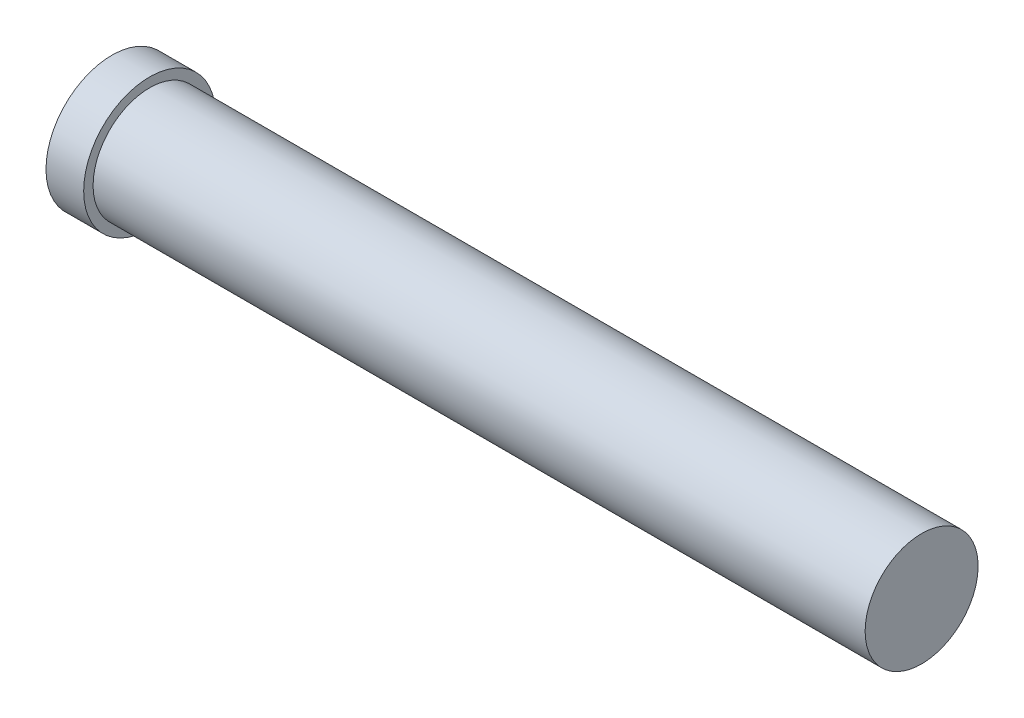
ISO-10303-21;
HEADER;
FILE_DESCRIPTION(('STEP AP214'),'2;1');
FILE_NAME('part.step','',(''),(''),'','','');
FILE_SCHEMA(('AUTOMOTIVE_DESIGN { 1 0 10303 214 1 1 1 1 }'));
ENDSEC;
DATA;
#1=APPLICATION_CONTEXT('core data for automotive mechanical design processes');
#2=APPLICATION_PROTOCOL_DEFINITION('international standard','automotive_design',2000,#1);
#3=PRODUCT_CONTEXT('',#1,'mechanical');
#4=PRODUCT('Part','Part','',(#3));
#5=PRODUCT_RELATED_PRODUCT_CATEGORY('part','',(#4));
#6=PRODUCT_DEFINITION_FORMATION('','',#4);
#7=PRODUCT_DEFINITION_CONTEXT('part definition',#1,'design');
#8=PRODUCT_DEFINITION('design','',#6,#7);
#9=PRODUCT_DEFINITION_SHAPE('','',#8);
#10=(LENGTH_UNIT() NAMED_UNIT(*) SI_UNIT(.MILLI.,.METRE.));
#11=(NAMED_UNIT(*) PLANE_ANGLE_UNIT() SI_UNIT($,.RADIAN.));
#12=(NAMED_UNIT(*) SI_UNIT($,.STERADIAN.) SOLID_ANGLE_UNIT());
#13=UNCERTAINTY_MEASURE_WITH_UNIT(LENGTH_MEASURE(1.E-05),#10,'distance_accuracy_value','');
#14=(GEOMETRIC_REPRESENTATION_CONTEXT(3) GLOBAL_UNCERTAINTY_ASSIGNED_CONTEXT((#13)) GLOBAL_UNIT_ASSIGNED_CONTEXT((#10,
#11,#12)) REPRESENTATION_CONTEXT('',''));
#15=CARTESIAN_POINT('',(0.,0.,0.));
#16=DIRECTION('',(0.,0.,1.));
#17=DIRECTION('',(1.,0.,0.));
#18=AXIS2_PLACEMENT_3D('',#15,#16,#17);
#19=CARTESIAN_POINT('',(0.,0.,0.));
#20=DIRECTION('',(1.,0.,0.));
#21=DIRECTION('',(0.,0.,-1.));
#22=AXIS2_PLACEMENT_3D('',#19,#20,#21);
#23=PLANE('',#22);
#24=CARTESIAN_POINT('',(0.,0.,0.));
#25=DIRECTION('',(-1.,0.,0.));
#26=DIRECTION('',(0.,0.,1.));
#27=AXIS2_PLACEMENT_3D('',#24,#25,#26);
#28=CIRCLE('',#27,35.);
#29=CARTESIAN_POINT('',(0.,0.,35.));
#30=VERTEX_POINT('',#29);
#31=EDGE_CURVE('E10',#30,#30,#28,.T.);
#32=ORIENTED_EDGE('',*,*,#31,.T.);
#33=EDGE_LOOP('',(#32));
#34=FACE_BOUND('',#33,.T.);
#35=ADVANCED_FACE('F30',(#34),#23,.F.);
#36=CARTESIAN_POINT('',(0.,0.,0.));
#37=DIRECTION('',(-1.,0.,0.));
#38=DIRECTION('',(0.,0.,1.));
#39=AXIS2_PLACEMENT_3D('',#36,#37,#38);
#40=CYLINDRICAL_SURFACE('',#39,35.);
#41=ORIENTED_EDGE('',*,*,#31,.F.);
#42=EDGE_LOOP('',(#41));
#43=FACE_BOUND('',#42,.T.);
#44=CARTESIAN_POINT('',(20.,0.,0.));
#45=DIRECTION('',(-1.,0.,0.));
#46=DIRECTION('',(0.,0.,1.));
#47=AXIS2_PLACEMENT_3D('',#44,#45,#46);
#48=CIRCLE('',#47,35.);
#49=CARTESIAN_POINT('',(20.,0.,35.));
#50=VERTEX_POINT('',#49);
#51=EDGE_CURVE('E36',#50,#50,#48,.T.);
#52=ORIENTED_EDGE('',*,*,#51,.T.);
#53=EDGE_LOOP('',(#52));
#54=FACE_BOUND('',#53,.T.);
#55=ADVANCED_FACE('F62',(#43,#54),#40,.T.);
#56=CARTESIAN_POINT('',(20.,35.,0.));
#57=DIRECTION('',(-1.,0.,0.));
#58=DIRECTION('',(0.,0.,1.));
#59=AXIS2_PLACEMENT_3D('',#56,#57,#58);
#60=PLANE('',#59);
#61=ORIENTED_EDGE('',*,*,#51,.F.);
#62=EDGE_LOOP('',(#61));
#63=FACE_BOUND('',#62,.T.);
#64=CARTESIAN_POINT('',(20.,0.,0.));
#65=DIRECTION('',(-1.,0.,0.));
#66=DIRECTION('',(0.,0.,1.));
#67=AXIS2_PLACEMENT_3D('',#64,#65,#66);
#68=CIRCLE('',#67,30.);
#69=CARTESIAN_POINT('',(20.,0.,30.));
#70=VERTEX_POINT('',#69);
#71=EDGE_CURVE('E40',#70,#70,#68,.T.);
#72=ORIENTED_EDGE('',*,*,#71,.T.);
#73=EDGE_LOOP('',(#72));
#74=FACE_BOUND('',#73,.T.);
#75=ADVANCED_FACE('F58',(#63,#74),#60,.F.);
#76=CARTESIAN_POINT('',(0.,0.,0.));
#77=DIRECTION('',(-1.,0.,0.));
#78=DIRECTION('',(0.,0.,1.));
#79=AXIS2_PLACEMENT_3D('',#76,#77,#78);
#80=CYLINDRICAL_SURFACE('',#79,30.);
#81=ORIENTED_EDGE('',*,*,#71,.F.);
#82=EDGE_LOOP('',(#81));
#83=FACE_BOUND('',#82,.T.);
#84=CARTESIAN_POINT('',(430.,0.,0.));
#85=DIRECTION('',(-1.,0.,0.));
#86=DIRECTION('',(0.,0.,1.));
#87=AXIS2_PLACEMENT_3D('',#84,#85,#86);
#88=CIRCLE('',#87,30.);
#89=CARTESIAN_POINT('',(430.,0.,30.));
#90=VERTEX_POINT('',#89);
#91=EDGE_CURVE('E44',#90,#90,#88,.T.);
#92=ORIENTED_EDGE('',*,*,#91,.T.);
#93=EDGE_LOOP('',(#92));
#94=FACE_BOUND('',#93,.T.);
#95=ADVANCED_FACE('F50',(#83,#94),#80,.T.);
#96=CARTESIAN_POINT('',(430.,30.,0.));
#97=DIRECTION('',(-1.,0.,0.));
#98=DIRECTION('',(0.,0.,1.));
#99=AXIS2_PLACEMENT_3D('',#96,#97,#98);
#100=PLANE('',#99);
#101=ORIENTED_EDGE('',*,*,#91,.F.);
#102=EDGE_LOOP('',(#101));
#103=FACE_BOUND('',#102,.T.);
#104=ADVANCED_FACE('F52',(#103),#100,.F.);
#105=CLOSED_SHELL('',(#35,#55,#75,#95,#104));
#106=MANIFOLD_SOLID_BREP('B2',#105);
#107=ADVANCED_BREP_SHAPE_REPRESENTATION('',(#18,#106),#14);
#108=SHAPE_DEFINITION_REPRESENTATION(#9,#107);
ENDSEC;
END-ISO-10303-21;
